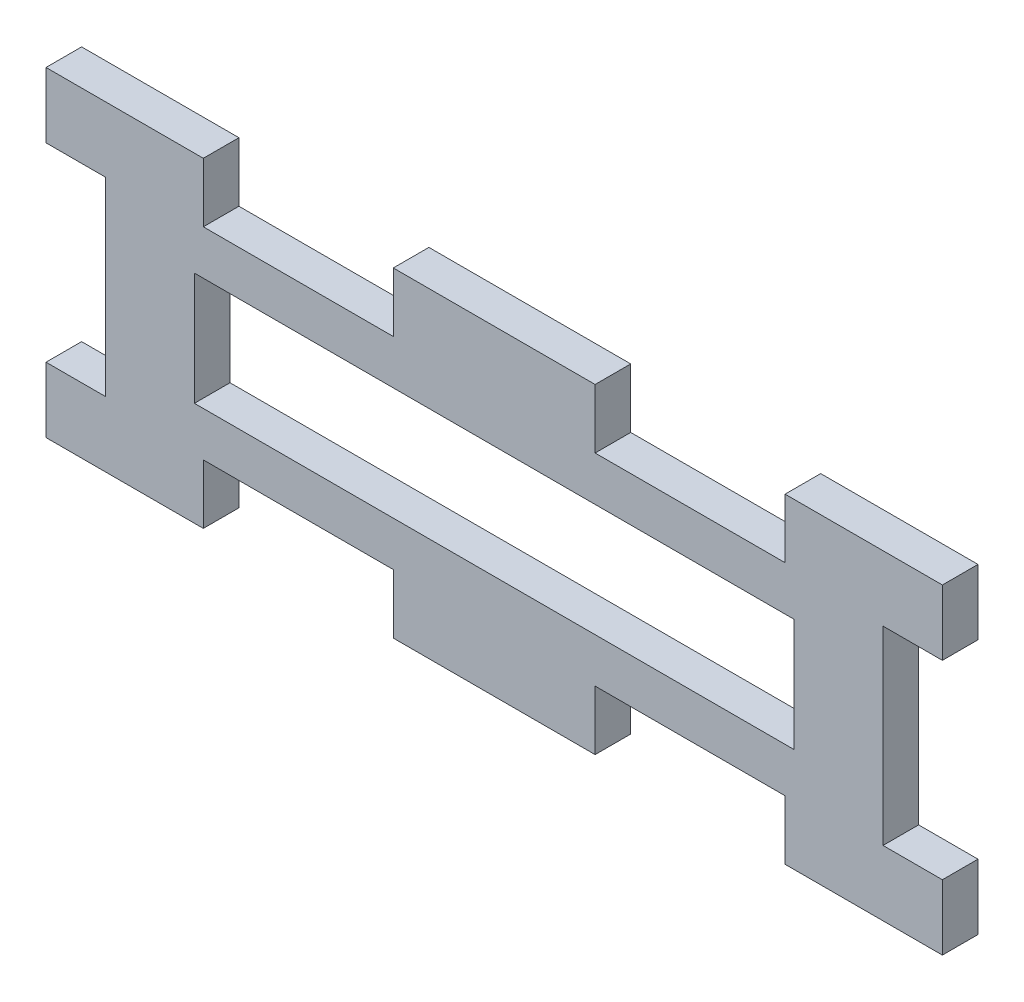
ISO-10303-21;
HEADER;
FILE_DESCRIPTION(('STEP AP214'),'2;1');
FILE_NAME('part.step','',(''),(''),'','','');
FILE_SCHEMA(('AUTOMOTIVE_DESIGN { 1 0 10303 214 1 1 1 1 }'));
ENDSEC;
DATA;
#1=APPLICATION_CONTEXT('core data for automotive mechanical design processes');
#2=APPLICATION_PROTOCOL_DEFINITION('international standard','automotive_design',2000,#1);
#3=PRODUCT_CONTEXT('',#1,'mechanical');
#4=PRODUCT('Part','Part','',(#3));
#5=PRODUCT_RELATED_PRODUCT_CATEGORY('part','',(#4));
#6=PRODUCT_DEFINITION_FORMATION('','',#4);
#7=PRODUCT_DEFINITION_CONTEXT('part definition',#1,'design');
#8=PRODUCT_DEFINITION('design','',#6,#7);
#9=PRODUCT_DEFINITION_SHAPE('','',#8);
#10=(LENGTH_UNIT() NAMED_UNIT(*) SI_UNIT(.MILLI.,.METRE.));
#11=(NAMED_UNIT(*) PLANE_ANGLE_UNIT() SI_UNIT($,.RADIAN.));
#12=(NAMED_UNIT(*) SI_UNIT($,.STERADIAN.) SOLID_ANGLE_UNIT());
#13=UNCERTAINTY_MEASURE_WITH_UNIT(LENGTH_MEASURE(1.E-05),#10,'distance_accuracy_value','');
#14=(GEOMETRIC_REPRESENTATION_CONTEXT(3) GLOBAL_UNCERTAINTY_ASSIGNED_CONTEXT((#13)) GLOBAL_UNIT_ASSIGNED_CONTEXT((#10,
#11,#12)) REPRESENTATION_CONTEXT('',''));
#15=CARTESIAN_POINT('',(0.,0.,0.));
#16=DIRECTION('',(0.,0.,1.));
#17=DIRECTION('',(1.,0.,0.));
#18=AXIS2_PLACEMENT_3D('',#15,#16,#17);
#19=CARTESIAN_POINT('',(75.5,-27.,-6.));
#20=DIRECTION('',(0.,-1.,0.));
#21=DIRECTION('',(1.,0.,0.));
#22=AXIS2_PLACEMENT_3D('',#19,#20,#21);
#23=PLANE('',#22);
#24=DIRECTION('',(0.,0.,1.));
#25=VECTOR('',#24,1.);
#26=CARTESIAN_POINT('',(17.,-27.,-10.));
#27=LINE('',#26,#25);
#28=CARTESIAN_POINT('',(17.,-27.,-6.));
#29=VERTEX_POINT('',#28);
#30=CARTESIAN_POINT('',(17.,-27.,0.));
#31=VERTEX_POINT('',#30);
#32=EDGE_CURVE('E269',#29,#31,#27,.T.);
#33=ORIENTED_EDGE('',*,*,#32,.T.);
#34=DIRECTION('',(1.,0.,0.));
#35=VECTOR('',#34,1.);
#36=CARTESIAN_POINT('',(75.5,-27.,0.));
#37=LINE('',#36,#35);
#38=CARTESIAN_POINT('',(-17.,-27.,0.));
#39=VERTEX_POINT('',#38);
#40=EDGE_CURVE('E474',#39,#31,#37,.T.);
#41=ORIENTED_EDGE('',*,*,#40,.F.);
#42=DIRECTION('',(0.,0.,1.));
#43=VECTOR('',#42,1.);
#44=CARTESIAN_POINT('',(-17.,-27.,-10.));
#45=LINE('',#44,#43);
#46=CARTESIAN_POINT('',(-17.,-27.,-6.));
#47=VERTEX_POINT('',#46);
#48=EDGE_CURVE('E287',#47,#39,#45,.T.);
#49=ORIENTED_EDGE('',*,*,#48,.F.);
#50=DIRECTION('',(1.,0.,0.));
#51=VECTOR('',#50,1.);
#52=CARTESIAN_POINT('',(75.5,-27.,-6.));
#53=LINE('',#52,#51);
#54=EDGE_CURVE('E458',#47,#29,#53,.T.);
#55=ORIENTED_EDGE('',*,*,#54,.T.);
#56=EDGE_LOOP('',(#33,#41,#49,#55));
#57=FACE_BOUND('',#56,.T.);
#58=ADVANCED_FACE('F33',(#57),#23,.T.);
#59=DIRECTION('',(0.,0.,1.));
#60=VECTOR('',#59,1.);
#61=CARTESIAN_POINT('',(49.,-27.,-10.));
#62=LINE('',#61,#60);
#63=CARTESIAN_POINT('',(49.,-27.,-6.));
#64=VERTEX_POINT('',#63);
#65=CARTESIAN_POINT('',(49.,-27.,0.));
#66=VERTEX_POINT('',#65);
#67=EDGE_CURVE('E50',#64,#66,#62,.T.);
#68=ORIENTED_EDGE('',*,*,#67,.F.);
#69=CARTESIAN_POINT('',(75.5,-27.,-6.));
#70=VERTEX_POINT('',#69);
#71=EDGE_CURVE('E454',#64,#70,#53,.T.);
#72=ORIENTED_EDGE('',*,*,#71,.T.);
#73=DIRECTION('',(0.,0.,1.));
#74=VECTOR('',#73,1.);
#75=CARTESIAN_POINT('',(75.5,-27.,-6.));
#76=LINE('',#75,#74);
#77=CARTESIAN_POINT('',(75.5,-27.,0.));
#78=VERTEX_POINT('',#77);
#79=EDGE_CURVE('E11',#70,#78,#76,.T.);
#80=ORIENTED_EDGE('',*,*,#79,.T.);
#81=EDGE_CURVE('E471',#66,#78,#37,.T.);
#82=ORIENTED_EDGE('',*,*,#81,.F.);
#83=EDGE_LOOP('',(#68,#72,#80,#82));
#84=FACE_BOUND('',#83,.T.);
#85=ADVANCED_FACE('F551',(#84),#23,.T.);
#86=CARTESIAN_POINT('',(75.5,27.,-6.));
#87=DIRECTION('',(0.,1.,0.));
#88=DIRECTION('',(-1.,0.,0.));
#89=AXIS2_PLACEMENT_3D('',#86,#87,#88);
#90=PLANE('',#89);
#91=DIRECTION('',(0.,0.,1.));
#92=VECTOR('',#91,1.);
#93=CARTESIAN_POINT('',(-17.,27.,-10.));
#94=LINE('',#93,#92);
#95=CARTESIAN_POINT('',(-17.,27.,-6.));
#96=VERTEX_POINT('',#95);
#97=CARTESIAN_POINT('',(-17.,27.,0.));
#98=VERTEX_POINT('',#97);
#99=EDGE_CURVE('E313',#96,#98,#94,.T.);
#100=ORIENTED_EDGE('',*,*,#99,.T.);
#101=DIRECTION('',(-1.,0.,0.));
#102=VECTOR('',#101,1.);
#103=CARTESIAN_POINT('',(75.5,27.,0.));
#104=LINE('',#103,#102);
#105=CARTESIAN_POINT('',(17.,27.,0.));
#106=VERTEX_POINT('',#105);
#107=EDGE_CURVE('E467',#106,#98,#104,.T.);
#108=ORIENTED_EDGE('',*,*,#107,.F.);
#109=DIRECTION('',(0.,0.,1.));
#110=VECTOR('',#109,1.);
#111=CARTESIAN_POINT('',(17.,27.,-10.));
#112=LINE('',#111,#110);
#113=CARTESIAN_POINT('',(17.,27.,-6.));
#114=VERTEX_POINT('',#113);
#115=EDGE_CURVE('E338',#114,#106,#112,.T.);
#116=ORIENTED_EDGE('',*,*,#115,.F.);
#117=DIRECTION('',(-1.,0.,0.));
#118=VECTOR('',#117,1.);
#119=CARTESIAN_POINT('',(75.5,27.,-6.));
#120=LINE('',#119,#118);
#121=EDGE_CURVE('E450',#114,#96,#120,.T.);
#122=ORIENTED_EDGE('',*,*,#121,.T.);
#123=EDGE_LOOP('',(#100,#108,#116,#122));
#124=FACE_BOUND('',#123,.T.);
#125=ADVANCED_FACE('F521',(#124),#90,.T.);
#126=DIRECTION('',(0.,0.,1.));
#127=VECTOR('',#126,1.);
#128=CARTESIAN_POINT('',(-49.,27.,-10.));
#129=LINE('',#128,#127);
#130=CARTESIAN_POINT('',(-49.,27.,-6.));
#131=VERTEX_POINT('',#130);
#132=CARTESIAN_POINT('',(-49.,27.,0.));
#133=VERTEX_POINT('',#132);
#134=EDGE_CURVE('E312',#131,#133,#129,.T.);
#135=ORIENTED_EDGE('',*,*,#134,.F.);
#136=CARTESIAN_POINT('',(-75.5,27.,-6.));
#137=VERTEX_POINT('',#136);
#138=EDGE_CURVE('E444',#131,#137,#120,.T.);
#139=ORIENTED_EDGE('',*,*,#138,.T.);
#140=DIRECTION('',(0.,0.,1.));
#141=VECTOR('',#140,1.);
#142=CARTESIAN_POINT('',(-75.5,27.,-6.));
#143=LINE('',#142,#141);
#144=CARTESIAN_POINT('',(-75.5,27.,0.));
#145=VERTEX_POINT('',#144);
#146=EDGE_CURVE('E477',#137,#145,#143,.T.);
#147=ORIENTED_EDGE('',*,*,#146,.T.);
#148=EDGE_CURVE('E462',#133,#145,#104,.T.);
#149=ORIENTED_EDGE('',*,*,#148,.F.);
#150=EDGE_LOOP('',(#135,#139,#147,#149));
#151=FACE_BOUND('',#150,.T.);
#152=ADVANCED_FACE('F528',(#151),#90,.T.);
#153=CARTESIAN_POINT('',(75.5,-27.,-6.));
#154=DIRECTION('',(1.,0.,0.));
#155=DIRECTION('',(0.,0.,-1.));
#156=AXIS2_PLACEMENT_3D('',#153,#154,#155);
#157=PLANE('',#156);
#158=DIRECTION('',(0.,0.,1.));
#159=VECTOR('',#158,1.);
#160=CARTESIAN_POINT('',(75.5,16.,-6.));
#161=LINE('',#160,#159);
#162=CARTESIAN_POINT('',(75.5,16.,-6.));
#163=VERTEX_POINT('',#162);
#164=CARTESIAN_POINT('',(75.5,16.,0.));
#165=VERTEX_POINT('',#164);
#166=EDGE_CURVE('E373',#163,#165,#161,.T.);
#167=ORIENTED_EDGE('',*,*,#166,.F.);
#168=DIRECTION('',(0.,1.,0.));
#169=VECTOR('',#168,1.);
#170=CARTESIAN_POINT('',(75.5,-27.,-6.));
#171=LINE('',#170,#169);
#172=CARTESIAN_POINT('',(75.5,27.,-6.));
#173=VERTEX_POINT('',#172);
#174=EDGE_CURVE('E445',#163,#173,#171,.T.);
#175=ORIENTED_EDGE('',*,*,#174,.T.);
#176=DIRECTION('',(0.,0.,1.));
#177=VECTOR('',#176,1.);
#178=CARTESIAN_POINT('',(75.5,27.,-6.));
#179=LINE('',#178,#177);
#180=CARTESIAN_POINT('',(75.5,27.,0.));
#181=VERTEX_POINT('',#180);
#182=EDGE_CURVE('E37',#173,#181,#179,.T.);
#183=ORIENTED_EDGE('',*,*,#182,.T.);
#184=DIRECTION('',(0.,1.,0.));
#185=VECTOR('',#184,1.);
#186=CARTESIAN_POINT('',(75.5,-27.,0.));
#187=LINE('',#186,#185);
#188=EDGE_CURVE('E434',#165,#181,#187,.T.);
#189=ORIENTED_EDGE('',*,*,#188,.F.);
#190=EDGE_LOOP('',(#167,#175,#183,#189));
#191=FACE_BOUND('',#190,.T.);
#192=ADVANCED_FACE('F489',(#191),#157,.T.);
#193=CARTESIAN_POINT('',(-75.5,-27.,-6.));
#194=DIRECTION('',(-1.,0.,0.));
#195=DIRECTION('',(0.,0.,1.));
#196=AXIS2_PLACEMENT_3D('',#193,#194,#195);
#197=PLANE('',#196);
#198=DIRECTION('',(0.,0.,1.));
#199=VECTOR('',#198,1.);
#200=CARTESIAN_POINT('',(-75.5,16.,-6.));
#201=LINE('',#200,#199);
#202=CARTESIAN_POINT('',(-75.5,16.,-6.));
#203=VERTEX_POINT('',#202);
#204=CARTESIAN_POINT('',(-75.5,16.,0.));
#205=VERTEX_POINT('',#204);
#206=EDGE_CURVE('E400',#203,#205,#201,.T.);
#207=ORIENTED_EDGE('',*,*,#206,.T.);
#208=DIRECTION('',(0.,-1.,0.));
#209=VECTOR('',#208,1.);
#210=CARTESIAN_POINT('',(-75.5,-27.,0.));
#211=LINE('',#210,#209);
#212=EDGE_CURVE('E468',#145,#205,#211,.T.);
#213=ORIENTED_EDGE('',*,*,#212,.F.);
#214=ORIENTED_EDGE('',*,*,#146,.F.);
#215=DIRECTION('',(0.,-1.,0.));
#216=VECTOR('',#215,1.);
#217=CARTESIAN_POINT('',(-75.5,-27.,-6.));
#218=LINE('',#217,#216);
#219=EDGE_CURVE('E451',#137,#203,#218,.T.);
#220=ORIENTED_EDGE('',*,*,#219,.T.);
#221=EDGE_LOOP('',(#207,#213,#214,#220));
#222=FACE_BOUND('',#221,.T.);
#223=ADVANCED_FACE('F569',(#222),#197,.T.);
#224=DIRECTION('',(0.,0.,1.));
#225=VECTOR('',#224,1.);
#226=CARTESIAN_POINT('',(75.5,-16.,-6.));
#227=LINE('',#226,#225);
#228=CARTESIAN_POINT('',(75.5,-16.,-6.));
#229=VERTEX_POINT('',#228);
#230=CARTESIAN_POINT('',(75.5,-16.,0.));
#231=VERTEX_POINT('',#230);
#232=EDGE_CURVE('E376',#229,#231,#227,.T.);
#233=ORIENTED_EDGE('',*,*,#232,.T.);
#234=EDGE_CURVE('E459',#78,#231,#187,.T.);
#235=ORIENTED_EDGE('',*,*,#234,.F.);
#236=ORIENTED_EDGE('',*,*,#79,.F.);
#237=EDGE_CURVE('E441',#70,#229,#171,.T.);
#238=ORIENTED_EDGE('',*,*,#237,.T.);
#239=EDGE_LOOP('',(#233,#235,#236,#238));
#240=FACE_BOUND('',#239,.T.);
#241=ADVANCED_FACE('F35',(#240),#157,.T.);
#242=DIRECTION('',(0.,0.,1.));
#243=VECTOR('',#242,1.);
#244=CARTESIAN_POINT('',(-49.,-27.,-10.));
#245=LINE('',#244,#243);
#246=CARTESIAN_POINT('',(-49.,-27.,-6.));
#247=VERTEX_POINT('',#246);
#248=CARTESIAN_POINT('',(-49.,-27.,0.));
#249=VERTEX_POINT('',#248);
#250=EDGE_CURVE('E290',#247,#249,#245,.T.);
#251=ORIENTED_EDGE('',*,*,#250,.T.);
#252=CARTESIAN_POINT('',(-75.5,-27.,0.));
#253=VERTEX_POINT('',#252);
#254=EDGE_CURVE('E472',#253,#249,#37,.T.);
#255=ORIENTED_EDGE('',*,*,#254,.F.);
#256=DIRECTION('',(0.,0.,1.));
#257=VECTOR('',#256,1.);
#258=CARTESIAN_POINT('',(-75.5,-27.,-6.));
#259=LINE('',#258,#257);
#260=CARTESIAN_POINT('',(-75.5,-27.,-6.));
#261=VERTEX_POINT('',#260);
#262=EDGE_CURVE('E42',#261,#253,#259,.T.);
#263=ORIENTED_EDGE('',*,*,#262,.F.);
#264=EDGE_CURVE('E455',#261,#247,#53,.T.);
#265=ORIENTED_EDGE('',*,*,#264,.T.);
#266=EDGE_LOOP('',(#251,#255,#263,#265));
#267=FACE_BOUND('',#266,.T.);
#268=ADVANCED_FACE('F554',(#267),#23,.T.);
#269=DIRECTION('',(0.,0.,1.));
#270=VECTOR('',#269,1.);
#271=CARTESIAN_POINT('',(-75.5,-16.,-6.));
#272=LINE('',#271,#270);
#273=CARTESIAN_POINT('',(-75.5,-16.,-6.));
#274=VERTEX_POINT('',#273);
#275=CARTESIAN_POINT('',(-75.5,-16.,0.));
#276=VERTEX_POINT('',#275);
#277=EDGE_CURVE('E393',#274,#276,#272,.T.);
#278=ORIENTED_EDGE('',*,*,#277,.F.);
#279=EDGE_CURVE('E449',#274,#261,#218,.T.);
#280=ORIENTED_EDGE('',*,*,#279,.T.);
#281=ORIENTED_EDGE('',*,*,#262,.T.);
#282=EDGE_CURVE('E466',#276,#253,#211,.T.);
#283=ORIENTED_EDGE('',*,*,#282,.F.);
#284=EDGE_LOOP('',(#278,#280,#281,#283));
#285=FACE_BOUND('',#284,.T.);
#286=ADVANCED_FACE('F562',(#285),#197,.T.);
#287=DIRECTION('',(0.,0.,1.));
#288=VECTOR('',#287,1.);
#289=CARTESIAN_POINT('',(49.,27.,-10.));
#290=LINE('',#289,#288);
#291=CARTESIAN_POINT('',(49.,27.,-6.));
#292=VERTEX_POINT('',#291);
#293=CARTESIAN_POINT('',(49.,27.,0.));
#294=VERTEX_POINT('',#293);
#295=EDGE_CURVE('E341',#292,#294,#290,.T.);
#296=ORIENTED_EDGE('',*,*,#295,.T.);
#297=EDGE_CURVE('E463',#181,#294,#104,.T.);
#298=ORIENTED_EDGE('',*,*,#297,.F.);
#299=ORIENTED_EDGE('',*,*,#182,.F.);
#300=EDGE_CURVE('E446',#173,#292,#120,.T.);
#301=ORIENTED_EDGE('',*,*,#300,.T.);
#302=EDGE_LOOP('',(#296,#298,#299,#301));
#303=FACE_BOUND('',#302,.T.);
#304=ADVANCED_FACE('F493',(#303),#90,.T.);
#305=CARTESIAN_POINT('',(0.,0.,-6.));
#306=DIRECTION('',(0.,0.,1.));
#307=DIRECTION('',(1.,0.,0.));
#308=AXIS2_PLACEMENT_3D('',#305,#306,#307);
#309=PLANE('',#308);
#310=DIRECTION('',(-1.,0.,0.));
#311=VECTOR('',#310,1.);
#312=CARTESIAN_POINT('',(0.,-17.,-6.));
#313=LINE('',#312,#311);
#314=CARTESIAN_POINT('',(49.,-17.,-6.));
#315=VERTEX_POINT('',#314);
#316=CARTESIAN_POINT('',(17.,-17.,-6.));
#317=VERTEX_POINT('',#316);
#318=EDGE_CURVE('E253',#315,#317,#313,.T.);
#319=ORIENTED_EDGE('',*,*,#318,.T.);
#320=DIRECTION('',(0.,-1.,0.));
#321=VECTOR('',#320,1.);
#322=CARTESIAN_POINT('',(17.,0.,-6.));
#323=LINE('',#322,#321);
#324=EDGE_CURVE('E277',#317,#29,#323,.T.);
#325=ORIENTED_EDGE('',*,*,#324,.T.);
#326=ORIENTED_EDGE('',*,*,#54,.F.);
#327=DIRECTION('',(0.,1.,0.));
#328=VECTOR('',#327,1.);
#329=CARTESIAN_POINT('',(-17.,0.,-6.));
#330=LINE('',#329,#328);
#331=CARTESIAN_POINT('',(-17.,-17.,-6.));
#332=VERTEX_POINT('',#331);
#333=EDGE_CURVE('E301',#47,#332,#330,.T.);
#334=ORIENTED_EDGE('',*,*,#333,.T.);
#335=DIRECTION('',(-1.,0.,0.));
#336=VECTOR('',#335,1.);
#337=CARTESIAN_POINT('',(0.,-17.,-6.));
#338=LINE('',#337,#336);
#339=CARTESIAN_POINT('',(-49.,-17.,-6.));
#340=VERTEX_POINT('',#339);
#341=EDGE_CURVE('E289',#332,#340,#338,.T.);
#342=ORIENTED_EDGE('',*,*,#341,.T.);
#343=DIRECTION('',(0.,-1.,0.));
#344=VECTOR('',#343,1.);
#345=CARTESIAN_POINT('',(-49.,0.,-6.));
#346=LINE('',#345,#344);
#347=EDGE_CURVE('E298',#340,#247,#346,.T.);
#348=ORIENTED_EDGE('',*,*,#347,.T.);
#349=ORIENTED_EDGE('',*,*,#264,.F.);
#350=ORIENTED_EDGE('',*,*,#279,.F.);
#351=DIRECTION('',(1.,0.,0.));
#352=VECTOR('',#351,1.);
#353=CARTESIAN_POINT('',(-75.5,-16.,-6.));
#354=LINE('',#353,#352);
#355=CARTESIAN_POINT('',(-65.5,-16.,-6.));
#356=VERTEX_POINT('',#355);
#357=EDGE_CURVE('E383',#274,#356,#354,.T.);
#358=ORIENTED_EDGE('',*,*,#357,.T.);
#359=DIRECTION('',(0.,1.,0.));
#360=VECTOR('',#359,1.);
#361=CARTESIAN_POINT('',(-65.5,16.,-6.));
#362=LINE('',#361,#360);
#363=CARTESIAN_POINT('',(-65.5,16.,-6.));
#364=VERTEX_POINT('',#363);
#365=EDGE_CURVE('E386',#356,#364,#362,.T.);
#366=ORIENTED_EDGE('',*,*,#365,.T.);
#367=DIRECTION('',(-1.,0.,0.));
#368=VECTOR('',#367,1.);
#369=CARTESIAN_POINT('',(-75.5,16.,-6.));
#370=LINE('',#369,#368);
#371=EDGE_CURVE('E390',#364,#203,#370,.T.);
#372=ORIENTED_EDGE('',*,*,#371,.T.);
#373=ORIENTED_EDGE('',*,*,#219,.F.);
#374=ORIENTED_EDGE('',*,*,#138,.F.);
#375=DIRECTION('',(0.,-1.,0.));
#376=VECTOR('',#375,1.);
#377=CARTESIAN_POINT('',(-49.,0.,-6.));
#378=LINE('',#377,#376);
#379=CARTESIAN_POINT('',(-49.,17.,-6.));
#380=VERTEX_POINT('',#379);
#381=EDGE_CURVE('E316',#131,#380,#378,.T.);
#382=ORIENTED_EDGE('',*,*,#381,.T.);
#383=DIRECTION('',(1.,0.,0.));
#384=VECTOR('',#383,1.);
#385=CARTESIAN_POINT('',(0.,17.,-6.));
#386=LINE('',#385,#384);
#387=CARTESIAN_POINT('',(-17.,17.,-6.));
#388=VERTEX_POINT('',#387);
#389=EDGE_CURVE('E324',#380,#388,#386,.T.);
#390=ORIENTED_EDGE('',*,*,#389,.T.);
#391=DIRECTION('',(0.,1.,0.));
#392=VECTOR('',#391,1.);
#393=CARTESIAN_POINT('',(-17.,0.,-6.));
#394=LINE('',#393,#392);
#395=EDGE_CURVE('E327',#388,#96,#394,.T.);
#396=ORIENTED_EDGE('',*,*,#395,.T.);
#397=ORIENTED_EDGE('',*,*,#121,.F.);
#398=DIRECTION('',(0.,-1.,0.));
#399=VECTOR('',#398,1.);
#400=CARTESIAN_POINT('',(17.,0.,-6.));
#401=LINE('',#400,#399);
#402=CARTESIAN_POINT('',(17.,17.,-6.));
#403=VERTEX_POINT('',#402);
#404=EDGE_CURVE('E353',#114,#403,#401,.T.);
#405=ORIENTED_EDGE('',*,*,#404,.T.);
#406=DIRECTION('',(1.,0.,0.));
#407=VECTOR('',#406,1.);
#408=CARTESIAN_POINT('',(0.,17.,-6.));
#409=LINE('',#408,#407);
#410=CARTESIAN_POINT('',(49.,17.,-6.));
#411=VERTEX_POINT('',#410);
#412=EDGE_CURVE('E340',#403,#411,#409,.T.);
#413=ORIENTED_EDGE('',*,*,#412,.T.);
#414=DIRECTION('',(0.,1.,0.));
#415=VECTOR('',#414,1.);
#416=CARTESIAN_POINT('',(49.,0.,-6.));
#417=LINE('',#416,#415);
#418=EDGE_CURVE('E350',#411,#292,#417,.T.);
#419=ORIENTED_EDGE('',*,*,#418,.T.);
#420=ORIENTED_EDGE('',*,*,#300,.F.);
#421=ORIENTED_EDGE('',*,*,#174,.F.);
#422=DIRECTION('',(-1.,0.,0.));
#423=VECTOR('',#422,1.);
#424=CARTESIAN_POINT('',(75.5,16.,-6.));
#425=LINE('',#424,#423);
#426=CARTESIAN_POINT('',(65.5,16.,-6.));
#427=VERTEX_POINT('',#426);
#428=EDGE_CURVE('E357',#163,#427,#425,.T.);
#429=ORIENTED_EDGE('',*,*,#428,.T.);
#430=DIRECTION('',(0.,-1.,0.));
#431=VECTOR('',#430,1.);
#432=CARTESIAN_POINT('',(65.5,16.,-6.));
#433=LINE('',#432,#431);
#434=CARTESIAN_POINT('',(65.5,-16.,-6.));
#435=VERTEX_POINT('',#434);
#436=EDGE_CURVE('E360',#427,#435,#433,.T.);
#437=ORIENTED_EDGE('',*,*,#436,.T.);
#438=DIRECTION('',(1.,0.,0.));
#439=VECTOR('',#438,1.);
#440=CARTESIAN_POINT('',(75.5,-16.,-6.));
#441=LINE('',#440,#439);
#442=EDGE_CURVE('E364',#435,#229,#441,.T.);
#443=ORIENTED_EDGE('',*,*,#442,.T.);
#444=ORIENTED_EDGE('',*,*,#237,.F.);
#445=ORIENTED_EDGE('',*,*,#71,.F.);
#446=DIRECTION('',(0.,1.,0.));
#447=VECTOR('',#446,1.);
#448=CARTESIAN_POINT('',(49.,0.,-6.));
#449=LINE('',#448,#447);
#450=EDGE_CURVE('E272',#64,#315,#449,.T.);
#451=ORIENTED_EDGE('',*,*,#450,.T.);
#452=EDGE_LOOP('',(#319,#325,#326,#334,#342,#348,#349,#350,#358,#366,#372,#373,#374,#382,#390,
#396,#397,#405,#413,#419,#420,#421,#429,#437,#443,#444,#445,#451));
#453=FACE_BOUND('',#452,.T.);
#454=DIRECTION('',(1.,0.,0.));
#455=VECTOR('',#454,1.);
#456=CARTESIAN_POINT('',(50.5,-9.5,-6.));
#457=LINE('',#456,#455);
#458=CARTESIAN_POINT('',(-50.5,-9.5,-6.));
#459=VERTEX_POINT('',#458);
#460=CARTESIAN_POINT('',(50.5,-9.5,-6.));
#461=VERTEX_POINT('',#460);
#462=EDGE_CURVE('E419',#459,#461,#457,.T.);
#463=ORIENTED_EDGE('',*,*,#462,.T.);
#464=DIRECTION('',(0.,1.,0.));
#465=VECTOR('',#464,1.);
#466=CARTESIAN_POINT('',(50.5,-9.5,-6.));
#467=LINE('',#466,#465);
#468=CARTESIAN_POINT('',(50.5,9.5,-6.));
#469=VERTEX_POINT('',#468);
#470=EDGE_CURVE('E409',#461,#469,#467,.T.);
#471=ORIENTED_EDGE('',*,*,#470,.T.);
#472=DIRECTION('',(-1.,0.,0.));
#473=VECTOR('',#472,1.);
#474=CARTESIAN_POINT('',(50.5,9.5,-6.));
#475=LINE('',#474,#473);
#476=CARTESIAN_POINT('',(-50.5,9.5,-6.));
#477=VERTEX_POINT('',#476);
#478=EDGE_CURVE('E412',#469,#477,#475,.T.);
#479=ORIENTED_EDGE('',*,*,#478,.T.);
#480=DIRECTION('',(0.,-1.,0.));
#481=VECTOR('',#480,1.);
#482=CARTESIAN_POINT('',(-50.5,-9.5,-6.));
#483=LINE('',#482,#481);
#484=EDGE_CURVE('E416',#477,#459,#483,.T.);
#485=ORIENTED_EDGE('',*,*,#484,.T.);
#486=EDGE_LOOP('',(#463,#471,#479,#485));
#487=FACE_BOUND('',#486,.T.);
#488=ADVANCED_FACE('F506',(#453,#487),#309,.F.);
#489=CARTESIAN_POINT('',(0.,0.,0.));
#490=DIRECTION('',(0.,0.,1.));
#491=DIRECTION('',(1.,0.,0.));
#492=AXIS2_PLACEMENT_3D('',#489,#490,#491);
#493=PLANE('',#492);
#494=DIRECTION('',(0.,-1.,0.));
#495=VECTOR('',#494,1.);
#496=CARTESIAN_POINT('',(17.,-27.,0.));
#497=LINE('',#496,#495);
#498=CARTESIAN_POINT('',(17.,-17.,0.));
#499=VERTEX_POINT('',#498);
#500=EDGE_CURVE('E265',#499,#31,#497,.T.);
#501=ORIENTED_EDGE('',*,*,#500,.F.);
#502=DIRECTION('',(-1.,0.,0.));
#503=VECTOR('',#502,1.);
#504=CARTESIAN_POINT('',(17.,-17.,0.));
#505=LINE('',#504,#503);
#506=CARTESIAN_POINT('',(49.,-17.,0.));
#507=VERTEX_POINT('',#506);
#508=EDGE_CURVE('E250',#507,#499,#505,.T.);
#509=ORIENTED_EDGE('',*,*,#508,.F.);
#510=DIRECTION('',(0.,1.,0.));
#511=VECTOR('',#510,1.);
#512=CARTESIAN_POINT('',(49.,-27.,0.));
#513=LINE('',#512,#511);
#514=EDGE_CURVE('E257',#66,#507,#513,.T.);
#515=ORIENTED_EDGE('',*,*,#514,.F.);
#516=ORIENTED_EDGE('',*,*,#81,.T.);
#517=ORIENTED_EDGE('',*,*,#234,.T.);
#518=DIRECTION('',(1.,0.,0.));
#519=VECTOR('',#518,1.);
#520=CARTESIAN_POINT('',(75.5,-16.,0.));
#521=LINE('',#520,#519);
#522=CARTESIAN_POINT('',(65.5,-16.,0.));
#523=VERTEX_POINT('',#522);
#524=EDGE_CURVE('E361',#523,#231,#521,.T.);
#525=ORIENTED_EDGE('',*,*,#524,.F.);
#526=DIRECTION('',(0.,-1.,0.));
#527=VECTOR('',#526,1.);
#528=CARTESIAN_POINT('',(65.5,16.,0.));
#529=LINE('',#528,#527);
#530=CARTESIAN_POINT('',(65.5,16.,0.));
#531=VERTEX_POINT('',#530);
#532=EDGE_CURVE('E369',#531,#523,#529,.T.);
#533=ORIENTED_EDGE('',*,*,#532,.F.);
#534=DIRECTION('',(-1.,0.,0.));
#535=VECTOR('',#534,1.);
#536=CARTESIAN_POINT('',(75.5,16.,0.));
#537=LINE('',#536,#535);
#538=EDGE_CURVE('E356',#165,#531,#537,.T.);
#539=ORIENTED_EDGE('',*,*,#538,.F.);
#540=ORIENTED_EDGE('',*,*,#188,.T.);
#541=ORIENTED_EDGE('',*,*,#297,.T.);
#542=DIRECTION('',(0.,1.,0.));
#543=VECTOR('',#542,1.);
#544=CARTESIAN_POINT('',(49.,27.,0.));
#545=LINE('',#544,#543);
#546=CARTESIAN_POINT('',(49.,17.,0.));
#547=VERTEX_POINT('',#546);
#548=EDGE_CURVE('E335',#547,#294,#545,.T.);
#549=ORIENTED_EDGE('',*,*,#548,.F.);
#550=DIRECTION('',(1.,0.,0.));
#551=VECTOR('',#550,1.);
#552=CARTESIAN_POINT('',(17.,17.,0.));
#553=LINE('',#552,#551);
#554=CARTESIAN_POINT('',(17.,17.,0.));
#555=VERTEX_POINT('',#554);
#556=EDGE_CURVE('E332',#555,#547,#553,.T.);
#557=ORIENTED_EDGE('',*,*,#556,.F.);
#558=DIRECTION('',(0.,-1.,0.));
#559=VECTOR('',#558,1.);
#560=CARTESIAN_POINT('',(17.,27.,0.));
#561=LINE('',#560,#559);
#562=EDGE_CURVE('E330',#106,#555,#561,.T.);
#563=ORIENTED_EDGE('',*,*,#562,.F.);
#564=ORIENTED_EDGE('',*,*,#107,.T.);
#565=DIRECTION('',(0.,1.,0.));
#566=VECTOR('',#565,1.);
#567=CARTESIAN_POINT('',(-17.,27.,0.));
#568=LINE('',#567,#566);
#569=CARTESIAN_POINT('',(-17.,17.,0.));
#570=VERTEX_POINT('',#569);
#571=EDGE_CURVE('E310',#570,#98,#568,.T.);
#572=ORIENTED_EDGE('',*,*,#571,.F.);
#573=DIRECTION('',(1.,0.,0.));
#574=VECTOR('',#573,1.);
#575=CARTESIAN_POINT('',(-17.,17.,0.));
#576=LINE('',#575,#574);
#577=CARTESIAN_POINT('',(-49.,17.,0.));
#578=VERTEX_POINT('',#577);
#579=EDGE_CURVE('E307',#578,#570,#576,.T.);
#580=ORIENTED_EDGE('',*,*,#579,.F.);
#581=DIRECTION('',(0.,-1.,0.));
#582=VECTOR('',#581,1.);
#583=CARTESIAN_POINT('',(-49.,27.,0.));
#584=LINE('',#583,#582);
#585=EDGE_CURVE('E304',#133,#578,#584,.T.);
#586=ORIENTED_EDGE('',*,*,#585,.F.);
#587=ORIENTED_EDGE('',*,*,#148,.T.);
#588=ORIENTED_EDGE('',*,*,#212,.T.);
#589=DIRECTION('',(-1.,0.,0.));
#590=VECTOR('',#589,1.);
#591=CARTESIAN_POINT('',(-75.5,16.,0.));
#592=LINE('',#591,#590);
#593=CARTESIAN_POINT('',(-65.5,16.,0.));
#594=VERTEX_POINT('',#593);
#595=EDGE_CURVE('E387',#594,#205,#592,.T.);
#596=ORIENTED_EDGE('',*,*,#595,.F.);
#597=DIRECTION('',(0.,1.,0.));
#598=VECTOR('',#597,1.);
#599=CARTESIAN_POINT('',(-65.5,16.,0.));
#600=LINE('',#599,#598);
#601=CARTESIAN_POINT('',(-65.5,-16.,0.));
#602=VERTEX_POINT('',#601);
#603=EDGE_CURVE('E396',#602,#594,#600,.T.);
#604=ORIENTED_EDGE('',*,*,#603,.F.);
#605=DIRECTION('',(1.,0.,0.));
#606=VECTOR('',#605,1.);
#607=CARTESIAN_POINT('',(-75.5,-16.,0.));
#608=LINE('',#607,#606);
#609=EDGE_CURVE('E375',#276,#602,#608,.T.);
#610=ORIENTED_EDGE('',*,*,#609,.F.);
#611=ORIENTED_EDGE('',*,*,#282,.T.);
#612=ORIENTED_EDGE('',*,*,#254,.T.);
#613=DIRECTION('',(0.,-1.,0.));
#614=VECTOR('',#613,1.);
#615=CARTESIAN_POINT('',(-49.,-27.,0.));
#616=LINE('',#615,#614);
#617=CARTESIAN_POINT('',(-49.,-17.,0.));
#618=VERTEX_POINT('',#617);
#619=EDGE_CURVE('E284',#618,#249,#616,.T.);
#620=ORIENTED_EDGE('',*,*,#619,.F.);
#621=DIRECTION('',(-1.,0.,0.));
#622=VECTOR('',#621,1.);
#623=CARTESIAN_POINT('',(-17.,-17.,0.));
#624=LINE('',#623,#622);
#625=CARTESIAN_POINT('',(-17.,-17.,0.));
#626=VERTEX_POINT('',#625);
#627=EDGE_CURVE('E281',#626,#618,#624,.T.);
#628=ORIENTED_EDGE('',*,*,#627,.F.);
#629=DIRECTION('',(0.,1.,0.));
#630=VECTOR('',#629,1.);
#631=CARTESIAN_POINT('',(-17.,-27.,0.));
#632=LINE('',#631,#630);
#633=EDGE_CURVE('E58',#39,#626,#632,.T.);
#634=ORIENTED_EDGE('',*,*,#633,.F.);
#635=ORIENTED_EDGE('',*,*,#40,.T.);
#636=EDGE_LOOP('',(#501,#509,#515,#516,#517,#525,#533,#539,#540,#541,#549,#557,#563,#564,#572,
#580,#586,#587,#588,#596,#604,#610,#611,#612,#620,#628,#634,#635));
#637=FACE_BOUND('',#636,.T.);
#638=DIRECTION('',(0.,1.,0.));
#639=VECTOR('',#638,1.);
#640=CARTESIAN_POINT('',(50.5,-9.5,0.));
#641=LINE('',#640,#639);
#642=CARTESIAN_POINT('',(50.5,-9.5,0.));
#643=VERTEX_POINT('',#642);
#644=CARTESIAN_POINT('',(50.5,9.5,0.));
#645=VERTEX_POINT('',#644);
#646=EDGE_CURVE('E403',#643,#645,#641,.T.);
#647=ORIENTED_EDGE('',*,*,#646,.F.);
#648=DIRECTION('',(1.,0.,0.));
#649=VECTOR('',#648,1.);
#650=CARTESIAN_POINT('',(50.5,-9.5,0.));
#651=LINE('',#650,#649);
#652=CARTESIAN_POINT('',(-50.5,-9.5,0.));
#653=VERTEX_POINT('',#652);
#654=EDGE_CURVE('E413',#653,#643,#651,.T.);
#655=ORIENTED_EDGE('',*,*,#654,.F.);
#656=DIRECTION('',(0.,-1.,0.));
#657=VECTOR('',#656,1.);
#658=CARTESIAN_POINT('',(-50.5,-9.5,0.));
#659=LINE('',#658,#657);
#660=CARTESIAN_POINT('',(-50.5,9.5,0.));
#661=VERTEX_POINT('',#660);
#662=EDGE_CURVE('E427',#661,#653,#659,.T.);
#663=ORIENTED_EDGE('',*,*,#662,.F.);
#664=DIRECTION('',(-1.,0.,0.));
#665=VECTOR('',#664,1.);
#666=CARTESIAN_POINT('',(50.5,9.5,0.));
#667=LINE('',#666,#665);
#668=EDGE_CURVE('E424',#645,#661,#667,.T.);
#669=ORIENTED_EDGE('',*,*,#668,.F.);
#670=EDGE_LOOP('',(#647,#655,#663,#669));
#671=FACE_BOUND('',#670,.T.);
#672=ADVANCED_FACE('F262',(#637,#671),#493,.T.);
#673=CARTESIAN_POINT('',(50.5,-9.5,-6.));
#674=DIRECTION('',(1.,0.,0.));
#675=DIRECTION('',(0.,0.,-1.));
#676=AXIS2_PLACEMENT_3D('',#673,#674,#675);
#677=PLANE('',#676);
#678=ORIENTED_EDGE('',*,*,#646,.T.);
#679=DIRECTION('',(0.,0.,1.));
#680=VECTOR('',#679,1.);
#681=CARTESIAN_POINT('',(50.5,9.5,-6.));
#682=LINE('',#681,#680);
#683=EDGE_CURVE('E422',#469,#645,#682,.T.);
#684=ORIENTED_EDGE('',*,*,#683,.F.);
#685=ORIENTED_EDGE('',*,*,#470,.F.);
#686=DIRECTION('',(0.,0.,1.));
#687=VECTOR('',#686,1.);
#688=CARTESIAN_POINT('',(50.5,-9.5,-6.));
#689=LINE('',#688,#687);
#690=EDGE_CURVE('E432',#461,#643,#689,.T.);
#691=ORIENTED_EDGE('',*,*,#690,.T.);
#692=EDGE_LOOP('',(#678,#684,#685,#691));
#693=FACE_BOUND('',#692,.T.);
#694=ADVANCED_FACE('F645',(#693),#677,.F.);
#695=CARTESIAN_POINT('',(50.5,-9.5,-6.));
#696=DIRECTION('',(0.,-1.,0.));
#697=DIRECTION('',(0.,0.,-1.));
#698=AXIS2_PLACEMENT_3D('',#695,#696,#697);
#699=PLANE('',#698);
#700=ORIENTED_EDGE('',*,*,#654,.T.);
#701=ORIENTED_EDGE('',*,*,#690,.F.);
#702=ORIENTED_EDGE('',*,*,#462,.F.);
#703=DIRECTION('',(0.,0.,1.));
#704=VECTOR('',#703,1.);
#705=CARTESIAN_POINT('',(-50.5,-9.5,-6.));
#706=LINE('',#705,#704);
#707=EDGE_CURVE('E435',#459,#653,#706,.T.);
#708=ORIENTED_EDGE('',*,*,#707,.T.);
#709=EDGE_LOOP('',(#700,#701,#702,#708));
#710=FACE_BOUND('',#709,.T.);
#711=ADVANCED_FACE('F641',(#710),#699,.F.);
#712=CARTESIAN_POINT('',(-50.5,-9.5,-6.));
#713=DIRECTION('',(-1.,0.,0.));
#714=DIRECTION('',(0.,0.,1.));
#715=AXIS2_PLACEMENT_3D('',#712,#713,#714);
#716=PLANE('',#715);
#717=ORIENTED_EDGE('',*,*,#662,.T.);
#718=ORIENTED_EDGE('',*,*,#707,.F.);
#719=ORIENTED_EDGE('',*,*,#484,.F.);
#720=DIRECTION('',(0.,0.,1.));
#721=VECTOR('',#720,1.);
#722=CARTESIAN_POINT('',(-50.5,9.5,-6.));
#723=LINE('',#722,#721);
#724=EDGE_CURVE('E437',#477,#661,#723,.T.);
#725=ORIENTED_EDGE('',*,*,#724,.T.);
#726=EDGE_LOOP('',(#717,#718,#719,#725));
#727=FACE_BOUND('',#726,.T.);
#728=ADVANCED_FACE('F644',(#727),#716,.F.);
#729=CARTESIAN_POINT('',(50.5,9.5,-6.));
#730=DIRECTION('',(0.,1.,0.));
#731=DIRECTION('',(0.,0.,1.));
#732=AXIS2_PLACEMENT_3D('',#729,#730,#731);
#733=PLANE('',#732);
#734=ORIENTED_EDGE('',*,*,#668,.T.);
#735=ORIENTED_EDGE('',*,*,#724,.F.);
#736=ORIENTED_EDGE('',*,*,#478,.F.);
#737=ORIENTED_EDGE('',*,*,#683,.T.);
#738=EDGE_LOOP('',(#734,#735,#736,#737));
#739=FACE_BOUND('',#738,.T.);
#740=ADVANCED_FACE('F633',(#739),#733,.F.);
#741=CARTESIAN_POINT('',(-75.5,16.,-6.));
#742=DIRECTION('',(0.,1.,0.));
#743=DIRECTION('',(0.,0.,1.));
#744=AXIS2_PLACEMENT_3D('',#741,#742,#743);
#745=PLANE('',#744);
#746=ORIENTED_EDGE('',*,*,#595,.T.);
#747=ORIENTED_EDGE('',*,*,#206,.F.);
#748=ORIENTED_EDGE('',*,*,#371,.F.);
#749=DIRECTION('',(0.,0.,1.));
#750=VECTOR('',#749,1.);
#751=CARTESIAN_POINT('',(-65.5,16.,-6.));
#752=LINE('',#751,#750);
#753=EDGE_CURVE('E404',#364,#594,#752,.T.);
#754=ORIENTED_EDGE('',*,*,#753,.T.);
#755=EDGE_LOOP('',(#746,#747,#748,#754));
#756=FACE_BOUND('',#755,.T.);
#757=ADVANCED_FACE('F629',(#756),#745,.F.);
#758=CARTESIAN_POINT('',(-65.5,16.,-6.));
#759=DIRECTION('',(1.,0.,0.));
#760=DIRECTION('',(0.,0.,-1.));
#761=AXIS2_PLACEMENT_3D('',#758,#759,#760);
#762=PLANE('',#761);
#763=ORIENTED_EDGE('',*,*,#603,.T.);
#764=ORIENTED_EDGE('',*,*,#753,.F.);
#765=ORIENTED_EDGE('',*,*,#365,.F.);
#766=DIRECTION('',(0.,0.,1.));
#767=VECTOR('',#766,1.);
#768=CARTESIAN_POINT('',(-65.5,-16.,-6.));
#769=LINE('',#768,#767);
#770=EDGE_CURVE('E406',#356,#602,#769,.T.);
#771=ORIENTED_EDGE('',*,*,#770,.T.);
#772=EDGE_LOOP('',(#763,#764,#765,#771));
#773=FACE_BOUND('',#772,.T.);
#774=ADVANCED_FACE('F632',(#773),#762,.F.);
#775=CARTESIAN_POINT('',(-75.5,-16.,-6.));
#776=DIRECTION('',(0.,-1.,0.));
#777=DIRECTION('',(0.,0.,-1.));
#778=AXIS2_PLACEMENT_3D('',#775,#776,#777);
#779=PLANE('',#778);
#780=ORIENTED_EDGE('',*,*,#609,.T.);
#781=ORIENTED_EDGE('',*,*,#770,.F.);
#782=ORIENTED_EDGE('',*,*,#357,.F.);
#783=ORIENTED_EDGE('',*,*,#277,.T.);
#784=EDGE_LOOP('',(#780,#781,#782,#783));
#785=FACE_BOUND('',#784,.T.);
#786=ADVANCED_FACE('F628',(#785),#779,.F.);
#787=CARTESIAN_POINT('',(75.5,16.,-6.));
#788=DIRECTION('',(0.,1.,0.));
#789=DIRECTION('',(0.,0.,1.));
#790=AXIS2_PLACEMENT_3D('',#787,#788,#789);
#791=PLANE('',#790);
#792=ORIENTED_EDGE('',*,*,#538,.T.);
#793=DIRECTION('',(0.,0.,1.));
#794=VECTOR('',#793,1.);
#795=CARTESIAN_POINT('',(65.5,16.,-6.));
#796=LINE('',#795,#794);
#797=EDGE_CURVE('E367',#427,#531,#796,.T.);
#798=ORIENTED_EDGE('',*,*,#797,.F.);
#799=ORIENTED_EDGE('',*,*,#428,.F.);
#800=ORIENTED_EDGE('',*,*,#166,.T.);
#801=EDGE_LOOP('',(#792,#798,#799,#800));
#802=FACE_BOUND('',#801,.T.);
#803=ADVANCED_FACE('F500',(#802),#791,.F.);
#804=CARTESIAN_POINT('',(75.5,-16.,-6.));
#805=DIRECTION('',(0.,-1.,0.));
#806=DIRECTION('',(0.,0.,-1.));
#807=AXIS2_PLACEMENT_3D('',#804,#805,#806);
#808=PLANE('',#807);
#809=ORIENTED_EDGE('',*,*,#524,.T.);
#810=ORIENTED_EDGE('',*,*,#232,.F.);
#811=ORIENTED_EDGE('',*,*,#442,.F.);
#812=DIRECTION('',(0.,0.,1.));
#813=VECTOR('',#812,1.);
#814=CARTESIAN_POINT('',(65.5,-16.,-6.));
#815=LINE('',#814,#813);
#816=EDGE_CURVE('E379',#435,#523,#815,.T.);
#817=ORIENTED_EDGE('',*,*,#816,.T.);
#818=EDGE_LOOP('',(#809,#810,#811,#817));
#819=FACE_BOUND('',#818,.T.);
#820=ADVANCED_FACE('F594',(#819),#808,.F.);
#821=CARTESIAN_POINT('',(65.5,16.,-6.));
#822=DIRECTION('',(-1.,0.,0.));
#823=DIRECTION('',(0.,0.,1.));
#824=AXIS2_PLACEMENT_3D('',#821,#822,#823);
#825=PLANE('',#824);
#826=ORIENTED_EDGE('',*,*,#532,.T.);
#827=ORIENTED_EDGE('',*,*,#816,.F.);
#828=ORIENTED_EDGE('',*,*,#436,.F.);
#829=ORIENTED_EDGE('',*,*,#797,.T.);
#830=EDGE_LOOP('',(#826,#827,#828,#829));
#831=FACE_BOUND('',#830,.T.);
#832=ADVANCED_FACE('F503',(#831),#825,.F.);
#833=CARTESIAN_POINT('',(17.,27.,-10.));
#834=DIRECTION('',(-1.,0.,0.));
#835=DIRECTION('',(0.,-1.,0.));
#836=AXIS2_PLACEMENT_3D('',#833,#834,#835);
#837=PLANE('',#836);
#838=ORIENTED_EDGE('',*,*,#115,.T.);
#839=ORIENTED_EDGE('',*,*,#562,.T.);
#840=DIRECTION('',(0.,0.,1.));
#841=VECTOR('',#840,1.);
#842=CARTESIAN_POINT('',(17.,17.,-10.));
#843=LINE('',#842,#841);
#844=EDGE_CURVE('E337',#403,#555,#843,.T.);
#845=ORIENTED_EDGE('',*,*,#844,.F.);
#846=ORIENTED_EDGE('',*,*,#404,.F.);
#847=EDGE_LOOP('',(#838,#839,#845,#846));
#848=FACE_BOUND('',#847,.T.);
#849=ADVANCED_FACE('F618',(#848),#837,.F.);
#850=CARTESIAN_POINT('',(49.,27.,-10.));
#851=DIRECTION('',(1.,0.,0.));
#852=DIRECTION('',(0.,0.,-1.));
#853=AXIS2_PLACEMENT_3D('',#850,#851,#852);
#854=PLANE('',#853);
#855=DIRECTION('',(0.,0.,1.));
#856=VECTOR('',#855,1.);
#857=CARTESIAN_POINT('',(49.,17.,-10.));
#858=LINE('',#857,#856);
#859=EDGE_CURVE('E344',#411,#547,#858,.T.);
#860=ORIENTED_EDGE('',*,*,#859,.T.);
#861=ORIENTED_EDGE('',*,*,#548,.T.);
#862=ORIENTED_EDGE('',*,*,#295,.F.);
#863=ORIENTED_EDGE('',*,*,#418,.F.);
#864=EDGE_LOOP('',(#860,#861,#862,#863));
#865=FACE_BOUND('',#864,.T.);
#866=ADVANCED_FACE('F510',(#865),#854,.F.);
#867=CARTESIAN_POINT('',(17.,17.,-10.));
#868=DIRECTION('',(0.,-1.,0.));
#869=DIRECTION('',(0.,0.,-1.));
#870=AXIS2_PLACEMENT_3D('',#867,#868,#869);
#871=PLANE('',#870);
#872=ORIENTED_EDGE('',*,*,#844,.T.);
#873=ORIENTED_EDGE('',*,*,#556,.T.);
#874=ORIENTED_EDGE('',*,*,#859,.F.);
#875=ORIENTED_EDGE('',*,*,#412,.F.);
#876=EDGE_LOOP('',(#872,#873,#874,#875));
#877=FACE_BOUND('',#876,.T.);
#878=ADVANCED_FACE('F512',(#877),#871,.F.);
#879=CARTESIAN_POINT('',(-17.,27.,-10.));
#880=DIRECTION('',(1.,0.,0.));
#881=DIRECTION('',(0.,1.,0.));
#882=AXIS2_PLACEMENT_3D('',#879,#880,#881);
#883=PLANE('',#882);
#884=DIRECTION('',(0.,0.,1.));
#885=VECTOR('',#884,1.);
#886=CARTESIAN_POINT('',(-17.,17.,-10.));
#887=LINE('',#886,#885);
#888=EDGE_CURVE('E317',#388,#570,#887,.T.);
#889=ORIENTED_EDGE('',*,*,#888,.T.);
#890=ORIENTED_EDGE('',*,*,#571,.T.);
#891=ORIENTED_EDGE('',*,*,#99,.F.);
#892=ORIENTED_EDGE('',*,*,#395,.F.);
#893=EDGE_LOOP('',(#889,#890,#891,#892));
#894=FACE_BOUND('',#893,.T.);
#895=ADVANCED_FACE('F534',(#894),#883,.F.);
#896=CARTESIAN_POINT('',(-17.,17.,-10.));
#897=DIRECTION('',(0.,-1.,0.));
#898=DIRECTION('',(0.,0.,-1.));
#899=AXIS2_PLACEMENT_3D('',#896,#897,#898);
#900=PLANE('',#899);
#901=DIRECTION('',(0.,0.,1.));
#902=VECTOR('',#901,1.);
#903=CARTESIAN_POINT('',(-49.,17.,-10.));
#904=LINE('',#903,#902);
#905=EDGE_CURVE('E319',#380,#578,#904,.T.);
#906=ORIENTED_EDGE('',*,*,#905,.T.);
#907=ORIENTED_EDGE('',*,*,#579,.T.);
#908=ORIENTED_EDGE('',*,*,#888,.F.);
#909=ORIENTED_EDGE('',*,*,#389,.F.);
#910=EDGE_LOOP('',(#906,#907,#908,#909));
#911=FACE_BOUND('',#910,.T.);
#912=ADVANCED_FACE('F536',(#911),#900,.F.);
#913=CARTESIAN_POINT('',(-49.,27.,-10.));
#914=DIRECTION('',(-1.,0.,0.));
#915=DIRECTION('',(0.,0.,1.));
#916=AXIS2_PLACEMENT_3D('',#913,#914,#915);
#917=PLANE('',#916);
#918=ORIENTED_EDGE('',*,*,#134,.T.);
#919=ORIENTED_EDGE('',*,*,#585,.T.);
#920=ORIENTED_EDGE('',*,*,#905,.F.);
#921=ORIENTED_EDGE('',*,*,#381,.F.);
#922=EDGE_LOOP('',(#918,#919,#920,#921));
#923=FACE_BOUND('',#922,.T.);
#924=ADVANCED_FACE('F538',(#923),#917,.F.);
#925=CARTESIAN_POINT('',(-17.,-27.,-10.));
#926=DIRECTION('',(1.,0.,0.));
#927=DIRECTION('',(0.,1.,0.));
#928=AXIS2_PLACEMENT_3D('',#925,#926,#927);
#929=PLANE('',#928);
#930=ORIENTED_EDGE('',*,*,#48,.T.);
#931=ORIENTED_EDGE('',*,*,#633,.T.);
#932=DIRECTION('',(0.,0.,1.));
#933=VECTOR('',#932,1.);
#934=CARTESIAN_POINT('',(-17.,-17.,-10.));
#935=LINE('',#934,#933);
#936=EDGE_CURVE('E286',#332,#626,#935,.T.);
#937=ORIENTED_EDGE('',*,*,#936,.F.);
#938=ORIENTED_EDGE('',*,*,#333,.F.);
#939=EDGE_LOOP('',(#930,#931,#937,#938));
#940=FACE_BOUND('',#939,.T.);
#941=ADVANCED_FACE('F540',(#940),#929,.F.);
#942=CARTESIAN_POINT('',(-49.,-27.,-10.));
#943=DIRECTION('',(-1.,0.,0.));
#944=DIRECTION('',(0.,0.,1.));
#945=AXIS2_PLACEMENT_3D('',#942,#943,#944);
#946=PLANE('',#945);
#947=DIRECTION('',(0.,0.,1.));
#948=VECTOR('',#947,1.);
#949=CARTESIAN_POINT('',(-49.,-17.,-10.));
#950=LINE('',#949,#948);
#951=EDGE_CURVE('E293',#340,#618,#950,.T.);
#952=ORIENTED_EDGE('',*,*,#951,.T.);
#953=ORIENTED_EDGE('',*,*,#619,.T.);
#954=ORIENTED_EDGE('',*,*,#250,.F.);
#955=ORIENTED_EDGE('',*,*,#347,.F.);
#956=EDGE_LOOP('',(#952,#953,#954,#955));
#957=FACE_BOUND('',#956,.T.);
#958=ADVANCED_FACE('F546',(#957),#946,.F.);
#959=CARTESIAN_POINT('',(-17.,-17.,-10.));
#960=DIRECTION('',(0.,1.,0.));
#961=DIRECTION('',(0.,0.,1.));
#962=AXIS2_PLACEMENT_3D('',#959,#960,#961);
#963=PLANE('',#962);
#964=ORIENTED_EDGE('',*,*,#936,.T.);
#965=ORIENTED_EDGE('',*,*,#627,.T.);
#966=ORIENTED_EDGE('',*,*,#951,.F.);
#967=ORIENTED_EDGE('',*,*,#341,.F.);
#968=EDGE_LOOP('',(#964,#965,#966,#967));
#969=FACE_BOUND('',#968,.T.);
#970=ADVANCED_FACE('F584',(#969),#963,.F.);
#971=CARTESIAN_POINT('',(17.,-27.,-10.));
#972=DIRECTION('',(-1.,0.,0.));
#973=DIRECTION('',(0.,-1.,0.));
#974=AXIS2_PLACEMENT_3D('',#971,#972,#973);
#975=PLANE('',#974);
#976=DIRECTION('',(0.,0.,1.));
#977=VECTOR('',#976,1.);
#978=CARTESIAN_POINT('',(17.,-17.,-10.));
#979=LINE('',#978,#977);
#980=EDGE_CURVE('E255',#317,#499,#979,.T.);
#981=ORIENTED_EDGE('',*,*,#980,.T.);
#982=ORIENTED_EDGE('',*,*,#500,.T.);
#983=ORIENTED_EDGE('',*,*,#32,.F.);
#984=ORIENTED_EDGE('',*,*,#324,.F.);
#985=EDGE_LOOP('',(#981,#982,#983,#984));
#986=FACE_BOUND('',#985,.T.);
#987=ADVANCED_FACE('F596',(#986),#975,.F.);
#988=CARTESIAN_POINT('',(17.,-17.,-10.));
#989=DIRECTION('',(0.,1.,0.));
#990=DIRECTION('',(0.,0.,1.));
#991=AXIS2_PLACEMENT_3D('',#988,#989,#990);
#992=PLANE('',#991);
#993=DIRECTION('',(0.,0.,1.));
#994=VECTOR('',#993,1.);
#995=CARTESIAN_POINT('',(49.,-17.,-10.));
#996=LINE('',#995,#994);
#997=EDGE_CURVE('E246',#315,#507,#996,.T.);
#998=ORIENTED_EDGE('',*,*,#997,.T.);
#999=ORIENTED_EDGE('',*,*,#508,.T.);
#1000=ORIENTED_EDGE('',*,*,#980,.F.);
#1001=ORIENTED_EDGE('',*,*,#318,.F.);
#1002=EDGE_LOOP('',(#998,#999,#1000,#1001));
#1003=FACE_BOUND('',#1002,.T.);
#1004=ADVANCED_FACE('F247',(#1003),#992,.F.);
#1005=CARTESIAN_POINT('',(49.,-27.,-10.));
#1006=DIRECTION('',(1.,0.,0.));
#1007=DIRECTION('',(0.,0.,-1.));
#1008=AXIS2_PLACEMENT_3D('',#1005,#1006,#1007);
#1009=PLANE('',#1008);
#1010=ORIENTED_EDGE('',*,*,#67,.T.);
#1011=ORIENTED_EDGE('',*,*,#514,.T.);
#1012=ORIENTED_EDGE('',*,*,#997,.F.);
#1013=ORIENTED_EDGE('',*,*,#450,.F.);
#1014=EDGE_LOOP('',(#1010,#1011,#1012,#1013));
#1015=FACE_BOUND('',#1014,.T.);
#1016=ADVANCED_FACE('F258',(#1015),#1009,.F.);
#1017=CLOSED_SHELL('',(#58,#85,#125,#152,#192,#223,#241,#268,#286,#304,#488,#672,#694,#711,#728,
#740,#757,#774,#786,#803,#820,#832,#849,#866,#878,#895,#912,#924,#941,#958,#970,#987,#1004,#1016));
#1018=MANIFOLD_SOLID_BREP('B2',#1017);
#1019=ADVANCED_BREP_SHAPE_REPRESENTATION('',(#18,#1018),#14);
#1020=SHAPE_DEFINITION_REPRESENTATION(#9,#1019);
ENDSEC;
END-ISO-10303-21;
